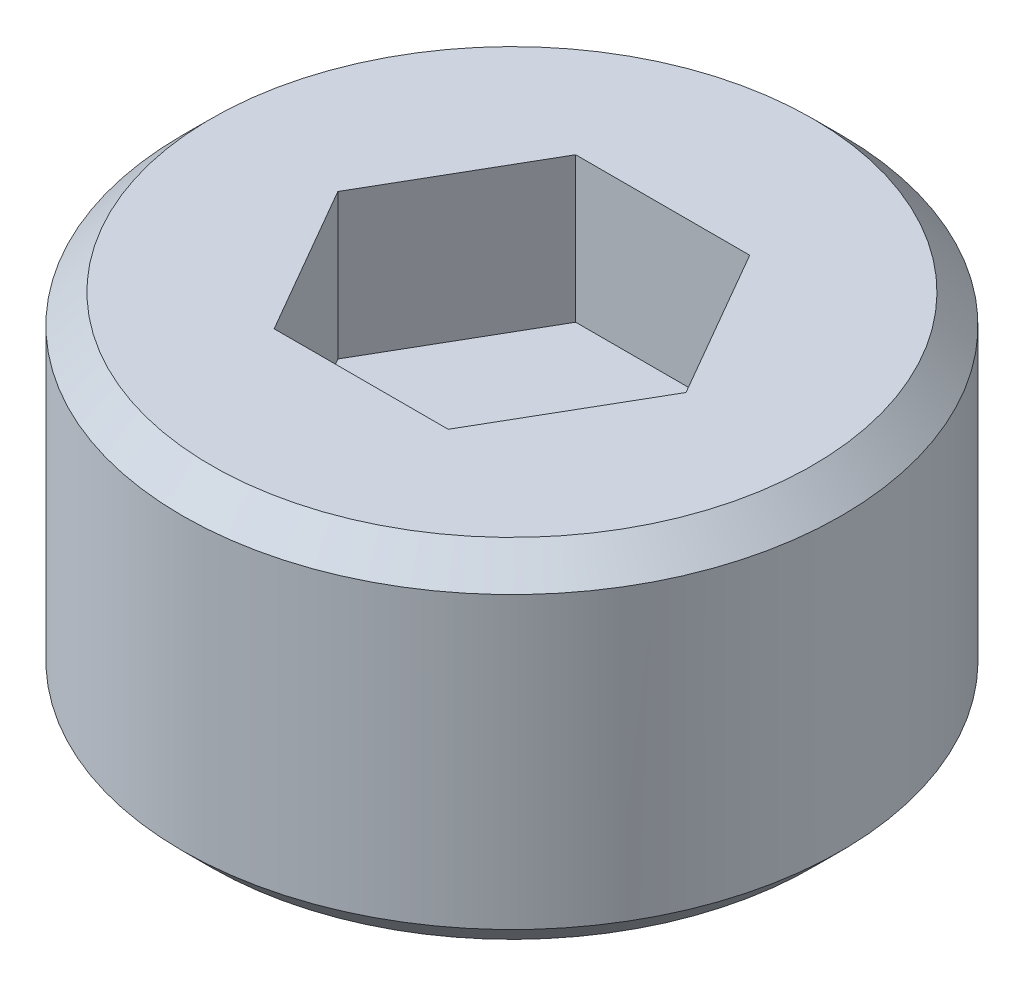
ISO-10303-21;
HEADER;
FILE_DESCRIPTION(('STEP AP214'),'2;1');
FILE_NAME('part.step','',(''),(''),'','','');
FILE_SCHEMA(('AUTOMOTIVE_DESIGN { 1 0 10303 214 1 1 1 1 }'));
ENDSEC;
DATA;
#1=APPLICATION_CONTEXT('core data for automotive mechanical design processes');
#2=APPLICATION_PROTOCOL_DEFINITION('international standard','automotive_design',2000,#1);
#3=PRODUCT_CONTEXT('',#1,'mechanical');
#4=PRODUCT('Part','Part','',(#3));
#5=PRODUCT_RELATED_PRODUCT_CATEGORY('part','',(#4));
#6=PRODUCT_DEFINITION_FORMATION('','',#4);
#7=PRODUCT_DEFINITION_CONTEXT('part definition',#1,'design');
#8=PRODUCT_DEFINITION('design','',#6,#7);
#9=PRODUCT_DEFINITION_SHAPE('','',#8);
#10=(LENGTH_UNIT() NAMED_UNIT(*) SI_UNIT(.MILLI.,.METRE.));
#11=(NAMED_UNIT(*) PLANE_ANGLE_UNIT() SI_UNIT($,.RADIAN.));
#12=(NAMED_UNIT(*) SI_UNIT($,.STERADIAN.) SOLID_ANGLE_UNIT());
#13=UNCERTAINTY_MEASURE_WITH_UNIT(LENGTH_MEASURE(1.E-05),#10,'distance_accuracy_value','');
#14=(GEOMETRIC_REPRESENTATION_CONTEXT(3) GLOBAL_UNCERTAINTY_ASSIGNED_CONTEXT((#13)) GLOBAL_UNIT_ASSIGNED_CONTEXT((#10,
#11,#12)) REPRESENTATION_CONTEXT('',''));
#15=CARTESIAN_POINT('',(0.,0.,0.));
#16=DIRECTION('',(0.,0.,1.));
#17=DIRECTION('',(1.,0.,0.));
#18=AXIS2_PLACEMENT_3D('',#15,#16,#17);
#19=CARTESIAN_POINT('',(0.,1.75,0.));
#20=DIRECTION('',(0.,1.,0.));
#21=DIRECTION('',(0.,0.,1.));
#22=AXIS2_PLACEMENT_3D('',#19,#20,#21);
#23=PLANE('',#22);
#24=DIRECTION('',(-0.500000000000017,0.,0.866025403784429));
#25=VECTOR('',#24,1.);
#26=CARTESIAN_POINT('',(-0.75,1.75,-1.299038105677));
#27=LINE('',#26,#25);
#28=CARTESIAN_POINT('',(-0.75,1.75,-1.299038105677));
#29=VERTEX_POINT('',#28);
#30=CARTESIAN_POINT('',(-1.50000000000009,1.75,-1.15168143271073E-13));
#31=VERTEX_POINT('',#30);
#32=EDGE_CURVE('E72',#29,#31,#27,.T.);
#33=ORIENTED_EDGE('',*,*,#32,.T.);
#34=DIRECTION('',(0.500000000000017,0.,0.866025403784429));
#35=VECTOR('',#34,1.);
#36=CARTESIAN_POINT('',(-1.5,1.75,0.));
#37=LINE('',#36,#35);
#38=CARTESIAN_POINT('',(-0.749999999999851,1.75,1.29903810567699));
#39=VERTEX_POINT('',#38);
#40=EDGE_CURVE('E125',#31,#39,#37,.T.);
#41=ORIENTED_EDGE('',*,*,#40,.T.);
#42=DIRECTION('',(1.,0.,0.));
#43=VECTOR('',#42,1.);
#44=CARTESIAN_POINT('',(-0.75,1.75,1.299038105677));
#45=LINE('',#44,#43);
#46=CARTESIAN_POINT('',(0.75,1.75,1.299038105677));
#47=VERTEX_POINT('',#46);
#48=EDGE_CURVE('E130',#39,#47,#45,.T.);
#49=ORIENTED_EDGE('',*,*,#48,.T.);
#50=DIRECTION('',(0.500000000000017,0.,-0.866025403784429));
#51=VECTOR('',#50,1.);
#52=CARTESIAN_POINT('',(0.75,1.75,1.299038105677));
#53=LINE('',#52,#51);
#54=CARTESIAN_POINT('',(1.50000000000005,1.75,0.));
#55=VERTEX_POINT('',#54);
#56=EDGE_CURVE('E134',#47,#55,#53,.T.);
#57=ORIENTED_EDGE('',*,*,#56,.T.);
#58=DIRECTION('',(-0.500000000000017,0.,-0.866025403784429));
#59=VECTOR('',#58,1.);
#60=CARTESIAN_POINT('',(1.5,1.75,0.));
#61=LINE('',#60,#59);
#62=CARTESIAN_POINT('',(0.74999999999985,1.75,-1.29903810567699));
#63=VERTEX_POINT('',#62);
#64=EDGE_CURVE('E68',#55,#63,#61,.T.);
#65=ORIENTED_EDGE('',*,*,#64,.T.);
#66=DIRECTION('',(-1.,0.,0.));
#67=VECTOR('',#66,1.);
#68=CARTESIAN_POINT('',(0.75,1.75,-1.299038105677));
#69=LINE('',#68,#67);
#70=EDGE_CURVE('E70',#63,#29,#69,.T.);
#71=ORIENTED_EDGE('',*,*,#70,.T.);
#72=EDGE_LOOP('',(#33,#41,#49,#57,#65,#71));
#73=FACE_BOUND('',#72,.T.);
#74=ADVANCED_FACE('F17',(#73),#23,.T.);
#75=CARTESIAN_POINT('',(-0.75,3.,-1.299038105677));
#76=DIRECTION('',(-0.866025403784429,0.,-0.500000000000017));
#77=DIRECTION('',(-0.500000000000017,0.,0.866025403784429));
#78=AXIS2_PLACEMENT_3D('',#75,#76,#77);
#79=PLANE('',#78);
#80=ORIENTED_EDGE('',*,*,#32,.F.);
#81=DIRECTION('',(0.,1.,0.));
#82=VECTOR('',#81,1.);
#83=CARTESIAN_POINT('',(-0.75,3.,-1.299038105677));
#84=LINE('',#83,#82);
#85=CARTESIAN_POINT('',(-0.75,3.,-1.299038105677));
#86=VERTEX_POINT('',#85);
#87=EDGE_CURVE('E77',#29,#86,#84,.T.);
#88=ORIENTED_EDGE('',*,*,#87,.T.);
#89=DIRECTION('',(0.499999999999942,0.,-0.866025403784472));
#90=VECTOR('',#89,1.);
#91=CARTESIAN_POINT('',(-1.5,3.,-1.416526265779E-13));
#92=LINE('',#91,#90);
#93=CARTESIAN_POINT('',(-1.50000000000009,3.,-1.35099718486812E-13));
#94=VERTEX_POINT('',#93);
#95=EDGE_CURVE('E120',#94,#86,#92,.T.);
#96=ORIENTED_EDGE('',*,*,#95,.F.);
#97=DIRECTION('',(0.,1.,0.));
#98=VECTOR('',#97,1.);
#99=CARTESIAN_POINT('',(-1.50000000000006,3.,-1.06251791915229E-13));
#100=LINE('',#99,#98);
#101=EDGE_CURVE('E83',#94,#31,#100,.F.);
#102=ORIENTED_EDGE('',*,*,#101,.T.);
#103=EDGE_LOOP('',(#80,#88,#96,#102));
#104=FACE_BOUND('',#103,.T.);
#105=ADVANCED_FACE('F80',(#104),#79,.F.);
#106=CARTESIAN_POINT('',(0.75,3.,-1.299038105677));
#107=DIRECTION('',(0.,0.,-1.));
#108=DIRECTION('',(-1.,0.,0.));
#109=AXIS2_PLACEMENT_3D('',#106,#107,#108);
#110=PLANE('',#109);
#111=ORIENTED_EDGE('',*,*,#70,.F.);
#112=DIRECTION('',(0.,1.,0.));
#113=VECTOR('',#112,1.);
#114=CARTESIAN_POINT('',(0.749999999999802,3.,-1.29903810567694));
#115=LINE('',#114,#113);
#116=CARTESIAN_POINT('',(0.7499999999998,3.,-1.29903810567699));
#117=VERTEX_POINT('',#116);
#118=EDGE_CURVE('E91',#63,#117,#115,.T.);
#119=ORIENTED_EDGE('',*,*,#118,.T.);
#120=DIRECTION('',(1.,0.,0.));
#121=VECTOR('',#120,1.);
#122=CARTESIAN_POINT('',(0.,3.,-1.299038105677));
#123=LINE('',#122,#121);
#124=EDGE_CURVE('E88',#86,#117,#123,.T.);
#125=ORIENTED_EDGE('',*,*,#124,.F.);
#126=ORIENTED_EDGE('',*,*,#87,.F.);
#127=EDGE_LOOP('',(#111,#119,#125,#126));
#128=FACE_BOUND('',#127,.T.);
#129=ADVANCED_FACE('F86',(#128),#110,.F.);
#130=CARTESIAN_POINT('',(1.5,3.,0.));
#131=DIRECTION('',(0.866025403784429,0.,-0.500000000000017));
#132=DIRECTION('',(-0.500000000000017,0.,-0.866025403784429));
#133=AXIS2_PLACEMENT_3D('',#130,#131,#132);
#134=PLANE('',#133);
#135=ORIENTED_EDGE('',*,*,#64,.F.);
#136=DIRECTION('',(0.,1.,0.));
#137=VECTOR('',#136,1.);
#138=CARTESIAN_POINT('',(1.50000000000015,3.,1.46367293285543E-13));
#139=LINE('',#138,#137);
#140=CARTESIAN_POINT('',(1.50000000000007,3.,1.25097151346974E-13));
#141=VERTEX_POINT('',#140);
#142=EDGE_CURVE('E132',#55,#141,#139,.T.);
#143=ORIENTED_EDGE('',*,*,#142,.T.);
#144=DIRECTION('',(0.49999999999996,0.,0.866025403784461));
#145=VECTOR('',#144,1.);
#146=CARTESIAN_POINT('',(0.7499999999998,3.,-1.299038105677));
#147=LINE('',#146,#145);
#148=EDGE_CURVE('E116',#117,#141,#147,.T.);
#149=ORIENTED_EDGE('',*,*,#148,.F.);
#150=ORIENTED_EDGE('',*,*,#118,.F.);
#151=EDGE_LOOP('',(#135,#143,#149,#150));
#152=FACE_BOUND('',#151,.T.);
#153=ADVANCED_FACE('F137',(#152),#134,.F.);
#154=CARTESIAN_POINT('',(0.75,3.,1.299038105677));
#155=DIRECTION('',(0.866025403784429,0.,0.500000000000017));
#156=DIRECTION('',(0.500000000000017,0.,-0.866025403784429));
#157=AXIS2_PLACEMENT_3D('',#154,#155,#156);
#158=PLANE('',#157);
#159=ORIENTED_EDGE('',*,*,#56,.F.);
#160=DIRECTION('',(0.,1.,0.));
#161=VECTOR('',#160,1.);
#162=CARTESIAN_POINT('',(0.75,3.,1.299038105677));
#163=LINE('',#162,#161);
#164=CARTESIAN_POINT('',(0.75,3.,1.299038105677));
#165=VERTEX_POINT('',#164);
#166=EDGE_CURVE('E128',#47,#165,#163,.T.);
#167=ORIENTED_EDGE('',*,*,#166,.T.);
#168=DIRECTION('',(-0.499999999999942,0.,0.866025403784472));
#169=VECTOR('',#168,1.);
#170=CARTESIAN_POINT('',(1.5,3.,1.416644579422E-13));
#171=LINE('',#170,#169);
#172=EDGE_CURVE('E111',#141,#165,#171,.T.);
#173=ORIENTED_EDGE('',*,*,#172,.F.);
#174=ORIENTED_EDGE('',*,*,#142,.F.);
#175=EDGE_LOOP('',(#159,#167,#173,#174));
#176=FACE_BOUND('',#175,.T.);
#177=ADVANCED_FACE('F148',(#176),#158,.F.);
#178=CARTESIAN_POINT('',(-0.75,3.,1.299038105677));
#179=DIRECTION('',(0.,0.,1.));
#180=DIRECTION('',(1.,0.,0.));
#181=AXIS2_PLACEMENT_3D('',#178,#179,#180);
#182=PLANE('',#181);
#183=ORIENTED_EDGE('',*,*,#48,.F.);
#184=DIRECTION('',(0.,1.,0.));
#185=VECTOR('',#184,1.);
#186=CARTESIAN_POINT('',(-0.749999999999802,3.,1.29903810567694));
#187=LINE('',#186,#185);
#188=CARTESIAN_POINT('',(-0.7499999999998,3.,1.29903810567699));
#189=VERTEX_POINT('',#188);
#190=EDGE_CURVE('E35',#39,#189,#187,.T.);
#191=ORIENTED_EDGE('',*,*,#190,.T.);
#192=DIRECTION('',(1.,0.,0.));
#193=VECTOR('',#192,1.);
#194=CARTESIAN_POINT('',(0.,3.,1.299038105677));
#195=LINE('',#194,#193);
#196=EDGE_CURVE('E107',#165,#189,#195,.F.);
#197=ORIENTED_EDGE('',*,*,#196,.F.);
#198=ORIENTED_EDGE('',*,*,#166,.F.);
#199=EDGE_LOOP('',(#183,#191,#197,#198));
#200=FACE_BOUND('',#199,.T.);
#201=ADVANCED_FACE('F146',(#200),#182,.F.);
#202=CARTESIAN_POINT('',(-1.5,3.,0.));
#203=DIRECTION('',(-0.866025403784429,0.,0.500000000000017));
#204=DIRECTION('',(0.500000000000017,0.,0.866025403784429));
#205=AXIS2_PLACEMENT_3D('',#202,#203,#204);
#206=PLANE('',#205);
#207=ORIENTED_EDGE('',*,*,#40,.F.);
#208=ORIENTED_EDGE('',*,*,#101,.F.);
#209=DIRECTION('',(-0.49999999999996,0.,-0.866025403784461));
#210=VECTOR('',#209,1.);
#211=CARTESIAN_POINT('',(-0.7499999999998,3.,1.299038105677));
#212=LINE('',#211,#210);
#213=EDGE_CURVE('E103',#189,#94,#212,.T.);
#214=ORIENTED_EDGE('',*,*,#213,.F.);
#215=ORIENTED_EDGE('',*,*,#190,.F.);
#216=EDGE_LOOP('',(#207,#208,#214,#215));
#217=FACE_BOUND('',#216,.T.);
#218=ADVANCED_FACE('F143',(#217),#206,.F.);
#219=CARTESIAN_POINT('',(0.,0.,0.));
#220=DIRECTION('',(0.,1.,0.));
#221=DIRECTION('',(0.,0.,1.));
#222=AXIS2_PLACEMENT_3D('',#219,#220,#221);
#223=PLANE('',#222);
#224=CARTESIAN_POINT('',(0.,0.,0.));
#225=DIRECTION('',(0.,1.,0.));
#226=DIRECTION('',(0.,0.,1.));
#227=AXIS2_PLACEMENT_3D('',#224,#225,#226);
#228=CIRCLE('',#227,2.58999999994103);
#229=CARTESIAN_POINT('',(0.,0.,2.58999999994103));
#230=VERTEX_POINT('',#229);
#231=EDGE_CURVE('E20',#230,#230,#228,.T.);
#232=ORIENTED_EDGE('',*,*,#231,.F.);
#233=EDGE_LOOP('',(#232));
#234=FACE_BOUND('',#233,.T.);
#235=ADVANCED_FACE('F176',(#234),#223,.F.);
#236=CARTESIAN_POINT('',(0.,3.,0.));
#237=DIRECTION('',(0.,1.,0.));
#238=DIRECTION('',(0.,0.,1.));
#239=AXIS2_PLACEMENT_3D('',#236,#237,#238);
#240=PLANE('',#239);
#241=ORIENTED_EDGE('',*,*,#196,.T.);
#242=ORIENTED_EDGE('',*,*,#213,.T.);
#243=ORIENTED_EDGE('',*,*,#95,.T.);
#244=ORIENTED_EDGE('',*,*,#124,.T.);
#245=ORIENTED_EDGE('',*,*,#148,.T.);
#246=ORIENTED_EDGE('',*,*,#172,.T.);
#247=EDGE_LOOP('',(#241,#242,#243,#244,#245,#246));
#248=FACE_BOUND('',#247,.T.);
#249=CARTESIAN_POINT('',(0.,2.9999999999859,0.));
#250=DIRECTION('',(0.,-1.,0.));
#251=DIRECTION('',(0.,0.,-1.));
#252=AXIS2_PLACEMENT_3D('',#249,#250,#251);
#253=CIRCLE('',#252,2.59000000005472);
#254=CARTESIAN_POINT('',(0.,2.9999999999859,-2.59000000005472));
#255=VERTEX_POINT('',#254);
#256=EDGE_CURVE('E96',#255,#255,#253,.T.);
#257=ORIENTED_EDGE('',*,*,#256,.F.);
#258=EDGE_LOOP('',(#257));
#259=FACE_BOUND('',#258,.T.);
#260=ADVANCED_FACE('F140',(#248,#259),#240,.T.);
#261=CARTESIAN_POINT('',(0.,0.249999999994088,0.));
#262=DIRECTION('',(0.,1.,0.));
#263=DIRECTION('',(0.,0.,1.));
#264=AXIS2_PLACEMENT_3D('',#261,#262,#263);
#265=CONICAL_SURFACE('',#264,2.83999999993512,0.785398163397448);
#266=CARTESIAN_POINT('',(0.,0.25,0.));
#267=DIRECTION('',(0.,1.,0.));
#268=DIRECTION('',(0.,0.,1.));
#269=AXIS2_PLACEMENT_3D('',#266,#267,#268);
#270=CIRCLE('',#269,2.84);
#271=CARTESIAN_POINT('',(0.,0.25,2.84));
#272=VERTEX_POINT('',#271);
#273=EDGE_CURVE('E26',#272,#272,#270,.T.);
#274=ORIENTED_EDGE('',*,*,#273,.F.);
#275=EDGE_LOOP('',(#274));
#276=FACE_BOUND('',#275,.T.);
#277=ORIENTED_EDGE('',*,*,#231,.T.);
#278=EDGE_LOOP('',(#277));
#279=FACE_BOUND('',#278,.T.);
#280=ADVANCED_FACE('F166',(#276,#279),#265,.T.);
#281=CARTESIAN_POINT('',(0.,2.74999999999181,0.));
#282=DIRECTION('',(0.,-1.,0.));
#283=DIRECTION('',(0.,0.,-1.));
#284=AXIS2_PLACEMENT_3D('',#281,#282,#283);
#285=CONICAL_SURFACE('',#284,2.8400000000488,0.785398163397448);
#286=CARTESIAN_POINT('',(0.,2.75,0.));
#287=DIRECTION('',(0.,1.,0.));
#288=DIRECTION('',(0.,0.,1.));
#289=AXIS2_PLACEMENT_3D('',#286,#287,#288);
#290=CIRCLE('',#289,2.84);
#291=CARTESIAN_POINT('',(0.,2.75,2.84));
#292=VERTEX_POINT('',#291);
#293=EDGE_CURVE('E11',#292,#292,#290,.F.);
#294=ORIENTED_EDGE('',*,*,#293,.F.);
#295=EDGE_LOOP('',(#294));
#296=FACE_BOUND('',#295,.T.);
#297=ORIENTED_EDGE('',*,*,#256,.T.);
#298=EDGE_LOOP('',(#297));
#299=FACE_BOUND('',#298,.T.);
#300=ADVANCED_FACE('F160',(#296,#299),#285,.T.);
#301=CARTESIAN_POINT('',(0.,0.,0.));
#302=DIRECTION('',(0.,1.,0.));
#303=DIRECTION('',(0.,0.,1.));
#304=AXIS2_PLACEMENT_3D('',#301,#302,#303);
#305=CYLINDRICAL_SURFACE('',#304,2.84);
#306=ORIENTED_EDGE('',*,*,#273,.T.);
#307=EDGE_LOOP('',(#306));
#308=FACE_BOUND('',#307,.T.);
#309=ORIENTED_EDGE('',*,*,#293,.T.);
#310=EDGE_LOOP('',(#309));
#311=FACE_BOUND('',#310,.T.);
#312=ADVANCED_FACE('F158',(#308,#311),#305,.T.);
#313=CLOSED_SHELL('',(#74,#105,#129,#153,#177,#201,#218,#235,#260,#280,#300,#312));
#314=MANIFOLD_SOLID_BREP('B1',#313);
#315=ADVANCED_BREP_SHAPE_REPRESENTATION('',(#18,#314),#14);
#316=SHAPE_DEFINITION_REPRESENTATION(#9,#315);
ENDSEC;
END-ISO-10303-21;
